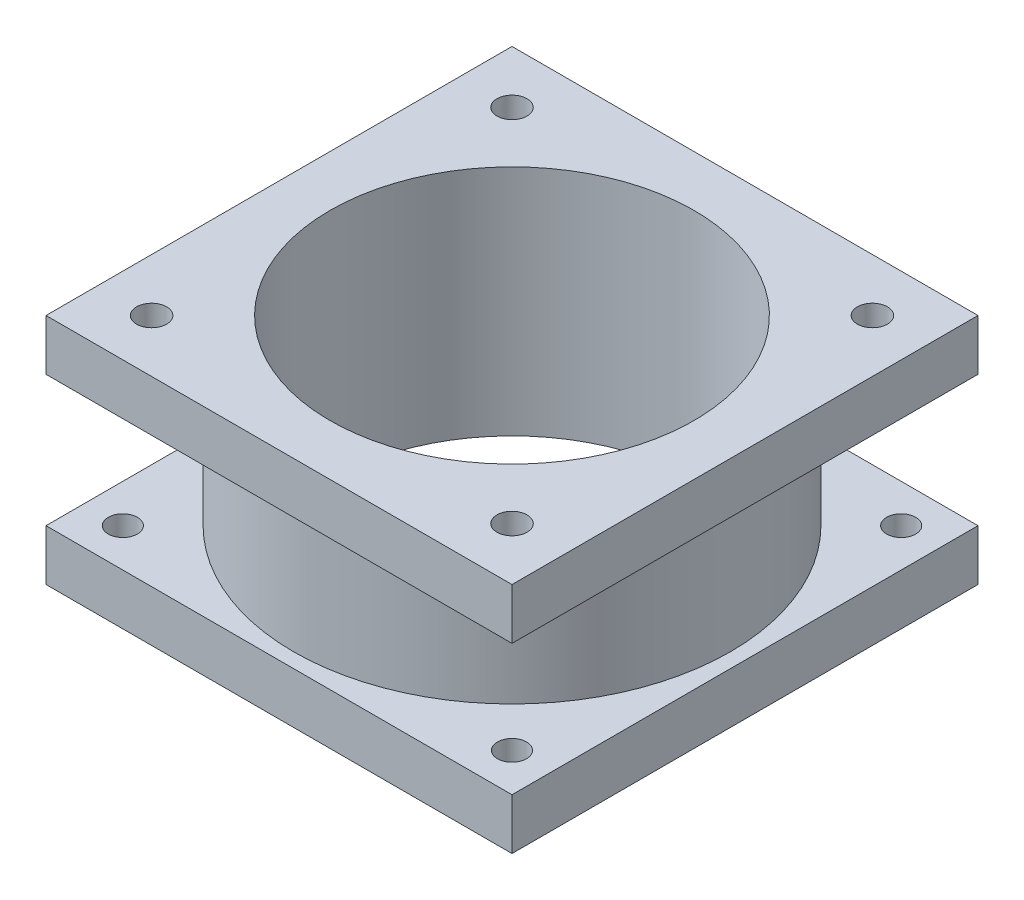
ISO-10303-21;
HEADER;
FILE_DESCRIPTION(('STEP AP214'),'2;1');
FILE_NAME('part.step','',(''),(''),'','','');
FILE_SCHEMA(('AUTOMOTIVE_DESIGN { 1 0 10303 214 1 1 1 1 }'));
ENDSEC;
DATA;
#1=APPLICATION_CONTEXT('core data for automotive mechanical design processes');
#2=APPLICATION_PROTOCOL_DEFINITION('international standard','automotive_design',2000,#1);
#3=PRODUCT_CONTEXT('',#1,'mechanical');
#4=PRODUCT('Part','Part','',(#3));
#5=PRODUCT_RELATED_PRODUCT_CATEGORY('part','',(#4));
#6=PRODUCT_DEFINITION_FORMATION('','',#4);
#7=PRODUCT_DEFINITION_CONTEXT('part definition',#1,'design');
#8=PRODUCT_DEFINITION('design','',#6,#7);
#9=PRODUCT_DEFINITION_SHAPE('','',#8);
#10=(LENGTH_UNIT() NAMED_UNIT(*) SI_UNIT(.MILLI.,.METRE.));
#11=(NAMED_UNIT(*) PLANE_ANGLE_UNIT() SI_UNIT($,.RADIAN.));
#12=(NAMED_UNIT(*) SI_UNIT($,.STERADIAN.) SOLID_ANGLE_UNIT());
#13=UNCERTAINTY_MEASURE_WITH_UNIT(LENGTH_MEASURE(1.E-05),#10,'distance_accuracy_value','');
#14=(GEOMETRIC_REPRESENTATION_CONTEXT(3) GLOBAL_UNCERTAINTY_ASSIGNED_CONTEXT((#13)) GLOBAL_UNIT_ASSIGNED_CONTEXT((#10,
#11,#12)) REPRESENTATION_CONTEXT('',''));
#15=CARTESIAN_POINT('',(0.,0.,0.));
#16=DIRECTION('',(0.,0.,1.));
#17=DIRECTION('',(1.,0.,0.));
#18=AXIS2_PLACEMENT_3D('',#15,#16,#17);
#19=CARTESIAN_POINT('',(0.,0.,0.));
#20=DIRECTION('',(0.,1.,0.));
#21=DIRECTION('',(1.,0.,0.));
#22=AXIS2_PLACEMENT_3D('',#19,#20,#21);
#23=PLANE('',#22);
#24=CARTESIAN_POINT('',(0.,0.,0.));
#25=DIRECTION('',(0.,1.,0.));
#26=DIRECTION('',(1.,0.,0.));
#27=AXIS2_PLACEMENT_3D('',#24,#25,#26);
#28=CIRCLE('',#27,25.);
#29=CARTESIAN_POINT('',(-25.,0.,0.));
#30=VERTEX_POINT('',#29);
#31=EDGE_CURVE('E205',#30,#30,#28,.T.);
#32=ORIENTED_EDGE('',*,*,#31,.T.);
#33=EDGE_LOOP('',(#32));
#34=FACE_BOUND('',#33,.T.);
#35=CARTESIAN_POINT('',(-26.7235211579369,0.,-26.7235211579369));
#36=DIRECTION('',(0.,1.,0.));
#37=DIRECTION('',(1.,0.,0.));
#38=AXIS2_PLACEMENT_3D('',#35,#36,#37);
#39=CIRCLE('',#38,2.);
#40=CARTESIAN_POINT('',(-28.7235211579369,0.,-26.7235211579369));
#41=VERTEX_POINT('',#40);
#42=EDGE_CURVE('E216',#41,#41,#39,.T.);
#43=ORIENTED_EDGE('',*,*,#42,.T.);
#44=EDGE_LOOP('',(#43));
#45=FACE_BOUND('',#44,.T.);
#46=CARTESIAN_POINT('',(26.7235211579369,0.,26.7235211579369));
#47=DIRECTION('',(0.,1.,0.));
#48=DIRECTION('',(1.,0.,0.));
#49=AXIS2_PLACEMENT_3D('',#46,#47,#48);
#50=CIRCLE('',#49,2.);
#51=CARTESIAN_POINT('',(24.7235211579369,0.,26.7235211579369));
#52=VERTEX_POINT('',#51);
#53=EDGE_CURVE('E277',#52,#52,#50,.T.);
#54=ORIENTED_EDGE('',*,*,#53,.T.);
#55=EDGE_LOOP('',(#54));
#56=FACE_BOUND('',#55,.T.);
#57=CARTESIAN_POINT('',(-26.7235211579369,0.,26.7235211579369));
#58=DIRECTION('',(0.,1.,0.));
#59=DIRECTION('',(1.,0.,0.));
#60=AXIS2_PLACEMENT_3D('',#57,#58,#59);
#61=CIRCLE('',#60,2.);
#62=CARTESIAN_POINT('',(-28.7235211579369,0.,26.7235211579369));
#63=VERTEX_POINT('',#62);
#64=EDGE_CURVE('E346',#63,#63,#61,.T.);
#65=ORIENTED_EDGE('',*,*,#64,.T.);
#66=EDGE_LOOP('',(#65));
#67=FACE_BOUND('',#66,.T.);
#68=CARTESIAN_POINT('',(26.7235211579369,0.,-26.7235211579369));
#69=DIRECTION('',(0.,1.,0.));
#70=DIRECTION('',(1.,0.,0.));
#71=AXIS2_PLACEMENT_3D('',#68,#69,#70);
#72=CIRCLE('',#71,2.);
#73=CARTESIAN_POINT('',(24.7235211579369,0.,-26.7235211579369));
#74=VERTEX_POINT('',#73);
#75=EDGE_CURVE('E297',#74,#74,#72,.T.);
#76=ORIENTED_EDGE('',*,*,#75,.T.);
#77=EDGE_LOOP('',(#76));
#78=FACE_BOUND('',#77,.T.);
#79=DIRECTION('',(0.,0.,1.));
#80=VECTOR('',#79,1.);
#81=CARTESIAN_POINT('',(-32.,0.,-32.));
#82=LINE('',#81,#80);
#83=CARTESIAN_POINT('',(-32.,0.,-32.));
#84=VERTEX_POINT('',#83);
#85=CARTESIAN_POINT('',(-32.,0.,32.));
#86=VERTEX_POINT('',#85);
#87=EDGE_CURVE('E28',#84,#86,#82,.T.);
#88=ORIENTED_EDGE('',*,*,#87,.F.);
#89=DIRECTION('',(-1.,0.,0.));
#90=VECTOR('',#89,1.);
#91=CARTESIAN_POINT('',(32.,0.,-32.));
#92=LINE('',#91,#90);
#93=CARTESIAN_POINT('',(32.,0.,-32.));
#94=VERTEX_POINT('',#93);
#95=EDGE_CURVE('E256',#94,#84,#92,.T.);
#96=ORIENTED_EDGE('',*,*,#95,.F.);
#97=DIRECTION('',(0.,0.,-1.));
#98=VECTOR('',#97,1.);
#99=CARTESIAN_POINT('',(32.,0.,32.));
#100=LINE('',#99,#98);
#101=CARTESIAN_POINT('',(32.,0.,32.));
#102=VERTEX_POINT('',#101);
#103=EDGE_CURVE('E234',#102,#94,#100,.T.);
#104=ORIENTED_EDGE('',*,*,#103,.F.);
#105=DIRECTION('',(1.,0.,0.));
#106=VECTOR('',#105,1.);
#107=CARTESIAN_POINT('',(-32.,0.,32.));
#108=LINE('',#107,#106);
#109=EDGE_CURVE('E223',#86,#102,#108,.T.);
#110=ORIENTED_EDGE('',*,*,#109,.F.);
#111=EDGE_LOOP('',(#88,#96,#104,#110));
#112=FACE_BOUND('',#111,.T.);
#113=ADVANCED_FACE('F17',(#34,#45,#56,#67,#78,#112),#23,.F.);
#114=CARTESIAN_POINT('',(0.,7.,0.));
#115=DIRECTION('',(0.,1.,0.));
#116=DIRECTION('',(1.,0.,0.));
#117=AXIS2_PLACEMENT_3D('',#114,#115,#116);
#118=PLANE('',#117);
#119=CARTESIAN_POINT('',(0.,7.,0.));
#120=DIRECTION('',(0.,-1.,0.));
#121=DIRECTION('',(1.,0.,0.));
#122=AXIS2_PLACEMENT_3D('',#119,#120,#121);
#123=CIRCLE('',#122,30.);
#124=CARTESIAN_POINT('',(-30.,7.,0.));
#125=VERTEX_POINT('',#124);
#126=EDGE_CURVE('E253',#125,#125,#123,.T.);
#127=ORIENTED_EDGE('',*,*,#126,.T.);
#128=EDGE_LOOP('',(#127));
#129=FACE_BOUND('',#128,.T.);
#130=CARTESIAN_POINT('',(-26.7235211579369,7.,-26.7235211579369));
#131=DIRECTION('',(0.,-1.,0.));
#132=DIRECTION('',(1.,0.,0.));
#133=AXIS2_PLACEMENT_3D('',#130,#131,#132);
#134=CIRCLE('',#133,2.);
#135=CARTESIAN_POINT('',(-28.7235211579369,7.,-26.7235211579369));
#136=VERTEX_POINT('',#135);
#137=EDGE_CURVE('E273',#136,#136,#134,.T.);
#138=ORIENTED_EDGE('',*,*,#137,.T.);
#139=EDGE_LOOP('',(#138));
#140=FACE_BOUND('',#139,.T.);
#141=CARTESIAN_POINT('',(26.7235211579369,7.,26.7235211579369));
#142=DIRECTION('',(0.,-1.,0.));
#143=DIRECTION('',(1.,0.,0.));
#144=AXIS2_PLACEMENT_3D('',#141,#142,#143);
#145=CIRCLE('',#144,2.);
#146=CARTESIAN_POINT('',(24.7235211579369,7.,26.7235211579369));
#147=VERTEX_POINT('',#146);
#148=EDGE_CURVE('E357',#147,#147,#145,.T.);
#149=ORIENTED_EDGE('',*,*,#148,.T.);
#150=EDGE_LOOP('',(#149));
#151=FACE_BOUND('',#150,.T.);
#152=CARTESIAN_POINT('',(-26.7235211579369,7.,26.7235211579369));
#153=DIRECTION('',(0.,-1.,0.));
#154=DIRECTION('',(1.,0.,0.));
#155=AXIS2_PLACEMENT_3D('',#152,#153,#154);
#156=CIRCLE('',#155,2.);
#157=CARTESIAN_POINT('',(-28.7235211579369,7.,26.7235211579369));
#158=VERTEX_POINT('',#157);
#159=EDGE_CURVE('E292',#158,#158,#156,.T.);
#160=ORIENTED_EDGE('',*,*,#159,.T.);
#161=EDGE_LOOP('',(#160));
#162=FACE_BOUND('',#161,.T.);
#163=CARTESIAN_POINT('',(26.7235211579369,7.,-26.7235211579369));
#164=DIRECTION('',(0.,-1.,0.));
#165=DIRECTION('',(1.,0.,0.));
#166=AXIS2_PLACEMENT_3D('',#163,#164,#165);
#167=CIRCLE('',#166,2.);
#168=CARTESIAN_POINT('',(24.7235211579369,7.,-26.7235211579369));
#169=VERTEX_POINT('',#168);
#170=EDGE_CURVE('E265',#169,#169,#167,.T.);
#171=ORIENTED_EDGE('',*,*,#170,.T.);
#172=EDGE_LOOP('',(#171));
#173=FACE_BOUND('',#172,.T.);
#174=DIRECTION('',(0.,0.,1.));
#175=VECTOR('',#174,1.);
#176=CARTESIAN_POINT('',(-32.,7.,-32.));
#177=LINE('',#176,#175);
#178=CARTESIAN_POINT('',(-32.,7.,-32.));
#179=VERTEX_POINT('',#178);
#180=CARTESIAN_POINT('',(-32.,7.,32.));
#181=VERTEX_POINT('',#180);
#182=EDGE_CURVE('E11',#179,#181,#177,.T.);
#183=ORIENTED_EDGE('',*,*,#182,.T.);
#184=DIRECTION('',(1.,0.,0.));
#185=VECTOR('',#184,1.);
#186=CARTESIAN_POINT('',(-32.,7.,32.));
#187=LINE('',#186,#185);
#188=CARTESIAN_POINT('',(32.,7.,32.));
#189=VERTEX_POINT('',#188);
#190=EDGE_CURVE('E231',#181,#189,#187,.T.);
#191=ORIENTED_EDGE('',*,*,#190,.T.);
#192=DIRECTION('',(0.,0.,-1.));
#193=VECTOR('',#192,1.);
#194=CARTESIAN_POINT('',(32.,7.,32.));
#195=LINE('',#194,#193);
#196=CARTESIAN_POINT('',(32.,7.,-32.));
#197=VERTEX_POINT('',#196);
#198=EDGE_CURVE('E224',#189,#197,#195,.T.);
#199=ORIENTED_EDGE('',*,*,#198,.T.);
#200=DIRECTION('',(-1.,0.,0.));
#201=VECTOR('',#200,1.);
#202=CARTESIAN_POINT('',(32.,7.,-32.));
#203=LINE('',#202,#201);
#204=EDGE_CURVE('E245',#197,#179,#203,.T.);
#205=ORIENTED_EDGE('',*,*,#204,.T.);
#206=EDGE_LOOP('',(#183,#191,#199,#205));
#207=FACE_BOUND('',#206,.T.);
#208=ADVANCED_FACE('F421',(#129,#140,#151,#162,#173,#207),#118,.T.);
#209=CARTESIAN_POINT('',(-32.,0.,-32.));
#210=DIRECTION('',(-1.,0.,0.));
#211=DIRECTION('',(0.,0.,1.));
#212=AXIS2_PLACEMENT_3D('',#209,#210,#211);
#213=PLANE('',#212);
#214=ORIENTED_EDGE('',*,*,#87,.T.);
#215=DIRECTION('',(0.,1.,0.));
#216=VECTOR('',#215,1.);
#217=CARTESIAN_POINT('',(-32.,0.,32.));
#218=LINE('',#217,#216);
#219=EDGE_CURVE('E248',#86,#181,#218,.T.);
#220=ORIENTED_EDGE('',*,*,#219,.T.);
#221=ORIENTED_EDGE('',*,*,#182,.F.);
#222=DIRECTION('',(0.,1.,0.));
#223=VECTOR('',#222,1.);
#224=CARTESIAN_POINT('',(-32.,0.,-32.));
#225=LINE('',#224,#223);
#226=EDGE_CURVE('E261',#84,#179,#225,.T.);
#227=ORIENTED_EDGE('',*,*,#226,.F.);
#228=EDGE_LOOP('',(#214,#220,#221,#227));
#229=FACE_BOUND('',#228,.T.);
#230=ADVANCED_FACE('F427',(#229),#213,.T.);
#231=CARTESIAN_POINT('',(-32.,0.,32.));
#232=DIRECTION('',(0.,0.,1.));
#233=DIRECTION('',(1.,0.,0.));
#234=AXIS2_PLACEMENT_3D('',#231,#232,#233);
#235=PLANE('',#234);
#236=ORIENTED_EDGE('',*,*,#109,.T.);
#237=DIRECTION('',(0.,1.,0.));
#238=VECTOR('',#237,1.);
#239=CARTESIAN_POINT('',(32.,0.,32.));
#240=LINE('',#239,#238);
#241=EDGE_CURVE('E220',#102,#189,#240,.T.);
#242=ORIENTED_EDGE('',*,*,#241,.T.);
#243=ORIENTED_EDGE('',*,*,#190,.F.);
#244=ORIENTED_EDGE('',*,*,#219,.F.);
#245=EDGE_LOOP('',(#236,#242,#243,#244));
#246=FACE_BOUND('',#245,.T.);
#247=ADVANCED_FACE('F441',(#246),#235,.T.);
#248=CARTESIAN_POINT('',(32.,0.,32.));
#249=DIRECTION('',(1.,0.,0.));
#250=DIRECTION('',(0.,1.,0.));
#251=AXIS2_PLACEMENT_3D('',#248,#249,#250);
#252=PLANE('',#251);
#253=ORIENTED_EDGE('',*,*,#103,.T.);
#254=DIRECTION('',(0.,1.,0.));
#255=VECTOR('',#254,1.);
#256=CARTESIAN_POINT('',(32.,0.,-32.));
#257=LINE('',#256,#255);
#258=EDGE_CURVE('E241',#94,#197,#257,.T.);
#259=ORIENTED_EDGE('',*,*,#258,.T.);
#260=ORIENTED_EDGE('',*,*,#198,.F.);
#261=ORIENTED_EDGE('',*,*,#241,.F.);
#262=EDGE_LOOP('',(#253,#259,#260,#261));
#263=FACE_BOUND('',#262,.T.);
#264=ADVANCED_FACE('F439',(#263),#252,.T.);
#265=CARTESIAN_POINT('',(32.,0.,-32.));
#266=DIRECTION('',(0.,0.,-1.));
#267=DIRECTION('',(0.,-1.,0.));
#268=AXIS2_PLACEMENT_3D('',#265,#266,#267);
#269=PLANE('',#268);
#270=ORIENTED_EDGE('',*,*,#95,.T.);
#271=ORIENTED_EDGE('',*,*,#226,.T.);
#272=ORIENTED_EDGE('',*,*,#204,.F.);
#273=ORIENTED_EDGE('',*,*,#258,.F.);
#274=EDGE_LOOP('',(#270,#271,#272,#273));
#275=FACE_BOUND('',#274,.T.);
#276=ADVANCED_FACE('F19',(#275),#269,.T.);
#277=CARTESIAN_POINT('',(0.,7.,0.));
#278=DIRECTION('',(0.,1.,0.));
#279=DIRECTION('',(1.,0.,0.));
#280=AXIS2_PLACEMENT_3D('',#277,#278,#279);
#281=CYLINDRICAL_SURFACE('',#280,30.);
#282=CARTESIAN_POINT('',(0.,25.,0.));
#283=DIRECTION('',(0.,1.,0.));
#284=DIRECTION('',(1.,0.,0.));
#285=AXIS2_PLACEMENT_3D('',#282,#283,#284);
#286=CIRCLE('',#285,30.);
#287=CARTESIAN_POINT('',(-30.,25.,0.));
#288=VERTEX_POINT('',#287);
#289=EDGE_CURVE('E187',#288,#288,#286,.T.);
#290=ORIENTED_EDGE('',*,*,#289,.F.);
#291=DIRECTION('',(0.,-1.,0.));
#292=VECTOR('',#291,1.);
#293=CARTESIAN_POINT('',(-30.,7.,0.));
#294=LINE('',#293,#292);
#295=EDGE_CURVE('E257',#288,#125,#294,.T.);
#296=ORIENTED_EDGE('',*,*,#295,.T.);
#297=ORIENTED_EDGE('',*,*,#126,.F.);
#298=ORIENTED_EDGE('',*,*,#295,.F.);
#299=EDGE_LOOP('',(#290,#296,#297,#298));
#300=FACE_BOUND('',#299,.T.);
#301=ADVANCED_FACE('F396',(#300),#281,.T.);
#302=CARTESIAN_POINT('',(0.,32.,0.));
#303=DIRECTION('',(0.,1.,0.));
#304=DIRECTION('',(1.,0.,0.));
#305=AXIS2_PLACEMENT_3D('',#302,#303,#304);
#306=PLANE('',#305);
#307=CARTESIAN_POINT('',(0.,32.,0.));
#308=DIRECTION('',(0.,-1.,0.));
#309=DIRECTION('',(1.,0.,0.));
#310=AXIS2_PLACEMENT_3D('',#307,#308,#309);
#311=CIRCLE('',#310,25.);
#312=CARTESIAN_POINT('',(-25.,32.,0.));
#313=VERTEX_POINT('',#312);
#314=EDGE_CURVE('E218',#313,#313,#311,.T.);
#315=ORIENTED_EDGE('',*,*,#314,.T.);
#316=EDGE_LOOP('',(#315));
#317=FACE_BOUND('',#316,.T.);
#318=CARTESIAN_POINT('',(-24.7487373415292,32.,-24.7487373415292));
#319=DIRECTION('',(0.,-1.,0.));
#320=DIRECTION('',(1.,0.,0.));
#321=AXIS2_PLACEMENT_3D('',#318,#319,#320);
#322=CIRCLE('',#321,2.067);
#323=CARTESIAN_POINT('',(-26.8157373415292,32.,-24.7487373415292));
#324=VERTEX_POINT('',#323);
#325=EDGE_CURVE('E290',#324,#324,#322,.T.);
#326=ORIENTED_EDGE('',*,*,#325,.T.);
#327=EDGE_LOOP('',(#326));
#328=FACE_BOUND('',#327,.T.);
#329=CARTESIAN_POINT('',(24.7487373415292,32.,24.7487373415292));
#330=DIRECTION('',(0.,-1.,0.));
#331=DIRECTION('',(1.,0.,0.));
#332=AXIS2_PLACEMENT_3D('',#329,#330,#331);
#333=CIRCLE('',#332,2.067);
#334=CARTESIAN_POINT('',(22.6817373415292,32.,24.7487373415292));
#335=VERTEX_POINT('',#334);
#336=EDGE_CURVE('E361',#335,#335,#333,.T.);
#337=ORIENTED_EDGE('',*,*,#336,.T.);
#338=EDGE_LOOP('',(#337));
#339=FACE_BOUND('',#338,.T.);
#340=CARTESIAN_POINT('',(-24.7487373415292,32.,24.7487373415292));
#341=DIRECTION('',(0.,-1.,0.));
#342=DIRECTION('',(1.,0.,0.));
#343=AXIS2_PLACEMENT_3D('',#340,#341,#342);
#344=CIRCLE('',#343,2.067);
#345=CARTESIAN_POINT('',(-26.8157373415292,32.,24.7487373415292));
#346=VERTEX_POINT('',#345);
#347=EDGE_CURVE('E303',#346,#346,#344,.T.);
#348=ORIENTED_EDGE('',*,*,#347,.T.);
#349=EDGE_LOOP('',(#348));
#350=FACE_BOUND('',#349,.T.);
#351=CARTESIAN_POINT('',(24.7487373415292,32.,-24.7487373415292));
#352=DIRECTION('',(0.,-1.,0.));
#353=DIRECTION('',(1.,0.,0.));
#354=AXIS2_PLACEMENT_3D('',#351,#352,#353);
#355=CIRCLE('',#354,2.067);
#356=CARTESIAN_POINT('',(22.6817373415292,32.,-24.7487373415292));
#357=VERTEX_POINT('',#356);
#358=EDGE_CURVE('E317',#357,#357,#355,.T.);
#359=ORIENTED_EDGE('',*,*,#358,.T.);
#360=EDGE_LOOP('',(#359));
#361=FACE_BOUND('',#360,.T.);
#362=DIRECTION('',(0.,0.,1.));
#363=VECTOR('',#362,1.);
#364=CARTESIAN_POINT('',(-32.,32.,-32.));
#365=LINE('',#364,#363);
#366=CARTESIAN_POINT('',(-32.,32.,-32.));
#367=VERTEX_POINT('',#366);
#368=CARTESIAN_POINT('',(-32.,32.,32.));
#369=VERTEX_POINT('',#368);
#370=EDGE_CURVE('E181',#367,#369,#365,.T.);
#371=ORIENTED_EDGE('',*,*,#370,.T.);
#372=DIRECTION('',(1.,0.,0.));
#373=VECTOR('',#372,1.);
#374=CARTESIAN_POINT('',(-32.,32.,32.));
#375=LINE('',#374,#373);
#376=CARTESIAN_POINT('',(32.,32.,32.));
#377=VERTEX_POINT('',#376);
#378=EDGE_CURVE('E285',#369,#377,#375,.T.);
#379=ORIENTED_EDGE('',*,*,#378,.T.);
#380=DIRECTION('',(0.,0.,-1.));
#381=VECTOR('',#380,1.);
#382=CARTESIAN_POINT('',(32.,32.,32.));
#383=LINE('',#382,#381);
#384=CARTESIAN_POINT('',(32.,32.,-32.));
#385=VERTEX_POINT('',#384);
#386=EDGE_CURVE('E286',#377,#385,#383,.T.);
#387=ORIENTED_EDGE('',*,*,#386,.T.);
#388=DIRECTION('',(-1.,0.,0.));
#389=VECTOR('',#388,1.);
#390=CARTESIAN_POINT('',(32.,32.,-32.));
#391=LINE('',#390,#389);
#392=EDGE_CURVE('E186',#385,#367,#391,.T.);
#393=ORIENTED_EDGE('',*,*,#392,.T.);
#394=EDGE_LOOP('',(#371,#379,#387,#393));
#395=FACE_BOUND('',#394,.T.);
#396=ADVANCED_FACE('F393',(#317,#328,#339,#350,#361,#395),#306,.T.);
#397=CARTESIAN_POINT('',(-32.,25.,-32.));
#398=DIRECTION('',(-1.,0.,0.));
#399=DIRECTION('',(0.,0.,1.));
#400=AXIS2_PLACEMENT_3D('',#397,#398,#399);
#401=PLANE('',#400);
#402=DIRECTION('',(0.,0.,1.));
#403=VECTOR('',#402,1.);
#404=CARTESIAN_POINT('',(-32.,25.,-32.));
#405=LINE('',#404,#403);
#406=CARTESIAN_POINT('',(-32.,25.,-32.));
#407=VERTEX_POINT('',#406);
#408=CARTESIAN_POINT('',(-32.,25.,32.));
#409=VERTEX_POINT('',#408);
#410=EDGE_CURVE('E180',#407,#409,#405,.T.);
#411=ORIENTED_EDGE('',*,*,#410,.T.);
#412=DIRECTION('',(0.,1.,0.));
#413=VECTOR('',#412,1.);
#414=CARTESIAN_POINT('',(-32.,25.,32.));
#415=LINE('',#414,#413);
#416=EDGE_CURVE('E272',#409,#369,#415,.T.);
#417=ORIENTED_EDGE('',*,*,#416,.T.);
#418=ORIENTED_EDGE('',*,*,#370,.F.);
#419=DIRECTION('',(0.,1.,0.));
#420=VECTOR('',#419,1.);
#421=CARTESIAN_POINT('',(-32.,25.,-32.));
#422=LINE('',#421,#420);
#423=EDGE_CURVE('E175',#407,#367,#422,.T.);
#424=ORIENTED_EDGE('',*,*,#423,.F.);
#425=EDGE_LOOP('',(#411,#417,#418,#424));
#426=FACE_BOUND('',#425,.T.);
#427=ADVANCED_FACE('F177',(#426),#401,.T.);
#428=CARTESIAN_POINT('',(-32.,25.,32.));
#429=DIRECTION('',(0.,0.,1.));
#430=DIRECTION('',(1.,0.,0.));
#431=AXIS2_PLACEMENT_3D('',#428,#429,#430);
#432=PLANE('',#431);
#433=DIRECTION('',(1.,0.,0.));
#434=VECTOR('',#433,1.);
#435=CARTESIAN_POINT('',(-32.,25.,32.));
#436=LINE('',#435,#434);
#437=CARTESIAN_POINT('',(32.,25.,32.));
#438=VERTEX_POINT('',#437);
#439=EDGE_CURVE('E203',#409,#438,#436,.T.);
#440=ORIENTED_EDGE('',*,*,#439,.T.);
#441=DIRECTION('',(0.,1.,0.));
#442=VECTOR('',#441,1.);
#443=CARTESIAN_POINT('',(32.,25.,32.));
#444=LINE('',#443,#442);
#445=EDGE_CURVE('E281',#438,#377,#444,.T.);
#446=ORIENTED_EDGE('',*,*,#445,.T.);
#447=ORIENTED_EDGE('',*,*,#378,.F.);
#448=ORIENTED_EDGE('',*,*,#416,.F.);
#449=EDGE_LOOP('',(#440,#446,#447,#448));
#450=FACE_BOUND('',#449,.T.);
#451=ADVANCED_FACE('F402',(#450),#432,.T.);
#452=CARTESIAN_POINT('',(32.,25.,32.));
#453=DIRECTION('',(1.,0.,0.));
#454=DIRECTION('',(0.,1.,0.));
#455=AXIS2_PLACEMENT_3D('',#452,#453,#454);
#456=PLANE('',#455);
#457=DIRECTION('',(0.,0.,-1.));
#458=VECTOR('',#457,1.);
#459=CARTESIAN_POINT('',(32.,25.,32.));
#460=LINE('',#459,#458);
#461=CARTESIAN_POINT('',(32.,25.,-32.));
#462=VERTEX_POINT('',#461);
#463=EDGE_CURVE('E198',#438,#462,#460,.T.);
#464=ORIENTED_EDGE('',*,*,#463,.T.);
#465=DIRECTION('',(0.,1.,0.));
#466=VECTOR('',#465,1.);
#467=CARTESIAN_POINT('',(32.,25.,-32.));
#468=LINE('',#467,#466);
#469=EDGE_CURVE('E193',#462,#385,#468,.T.);
#470=ORIENTED_EDGE('',*,*,#469,.T.);
#471=ORIENTED_EDGE('',*,*,#386,.F.);
#472=ORIENTED_EDGE('',*,*,#445,.F.);
#473=EDGE_LOOP('',(#464,#470,#471,#472));
#474=FACE_BOUND('',#473,.T.);
#475=ADVANCED_FACE('F405',(#474),#456,.T.);
#476=CARTESIAN_POINT('',(32.,25.,-32.));
#477=DIRECTION('',(0.,0.,-1.));
#478=DIRECTION('',(0.,-1.,0.));
#479=AXIS2_PLACEMENT_3D('',#476,#477,#478);
#480=PLANE('',#479);
#481=DIRECTION('',(-1.,0.,0.));
#482=VECTOR('',#481,1.);
#483=CARTESIAN_POINT('',(32.,25.,-32.));
#484=LINE('',#483,#482);
#485=EDGE_CURVE('E190',#462,#407,#484,.T.);
#486=ORIENTED_EDGE('',*,*,#485,.T.);
#487=ORIENTED_EDGE('',*,*,#423,.T.);
#488=ORIENTED_EDGE('',*,*,#392,.F.);
#489=ORIENTED_EDGE('',*,*,#469,.F.);
#490=EDGE_LOOP('',(#486,#487,#488,#489));
#491=FACE_BOUND('',#490,.T.);
#492=ADVANCED_FACE('F191',(#491),#480,.T.);
#493=CARTESIAN_POINT('',(0.,25.,0.));
#494=DIRECTION('',(0.,1.,0.));
#495=DIRECTION('',(1.,0.,0.));
#496=AXIS2_PLACEMENT_3D('',#493,#494,#495);
#497=PLANE('',#496);
#498=ORIENTED_EDGE('',*,*,#289,.T.);
#499=EDGE_LOOP('',(#498));
#500=FACE_BOUND('',#499,.T.);
#501=CARTESIAN_POINT('',(-24.7487373415292,25.,-24.7487373415292));
#502=DIRECTION('',(0.,1.,0.));
#503=DIRECTION('',(1.,0.,0.));
#504=AXIS2_PLACEMENT_3D('',#501,#502,#503);
#505=CIRCLE('',#504,2.067);
#506=CARTESIAN_POINT('',(-26.8157373415292,25.,-24.7487373415292));
#507=VERTEX_POINT('',#506);
#508=EDGE_CURVE('E21',#507,#507,#505,.T.);
#509=ORIENTED_EDGE('',*,*,#508,.T.);
#510=EDGE_LOOP('',(#509));
#511=FACE_BOUND('',#510,.T.);
#512=CARTESIAN_POINT('',(24.7487373415292,25.,24.7487373415292));
#513=DIRECTION('',(0.,1.,0.));
#514=DIRECTION('',(1.,0.,0.));
#515=AXIS2_PLACEMENT_3D('',#512,#513,#514);
#516=CIRCLE('',#515,2.067);
#517=CARTESIAN_POINT('',(22.6817373415292,25.,24.7487373415292));
#518=VERTEX_POINT('',#517);
#519=EDGE_CURVE('E287',#518,#518,#516,.T.);
#520=ORIENTED_EDGE('',*,*,#519,.T.);
#521=EDGE_LOOP('',(#520));
#522=FACE_BOUND('',#521,.T.);
#523=CARTESIAN_POINT('',(-24.7487373415292,25.,24.7487373415292));
#524=DIRECTION('',(0.,1.,0.));
#525=DIRECTION('',(1.,0.,0.));
#526=AXIS2_PLACEMENT_3D('',#523,#524,#525);
#527=CIRCLE('',#526,2.067);
#528=CARTESIAN_POINT('',(-26.8157373415292,25.,24.7487373415292));
#529=VERTEX_POINT('',#528);
#530=EDGE_CURVE('E302',#529,#529,#527,.T.);
#531=ORIENTED_EDGE('',*,*,#530,.T.);
#532=EDGE_LOOP('',(#531));
#533=FACE_BOUND('',#532,.T.);
#534=CARTESIAN_POINT('',(24.7487373415292,25.,-24.7487373415292));
#535=DIRECTION('',(0.,1.,0.));
#536=DIRECTION('',(1.,0.,0.));
#537=AXIS2_PLACEMENT_3D('',#534,#535,#536);
#538=CIRCLE('',#537,2.067);
#539=CARTESIAN_POINT('',(22.6817373415292,25.,-24.7487373415292));
#540=VERTEX_POINT('',#539);
#541=EDGE_CURVE('E337',#540,#540,#538,.T.);
#542=ORIENTED_EDGE('',*,*,#541,.T.);
#543=EDGE_LOOP('',(#542));
#544=FACE_BOUND('',#543,.T.);
#545=ORIENTED_EDGE('',*,*,#410,.F.);
#546=ORIENTED_EDGE('',*,*,#485,.F.);
#547=ORIENTED_EDGE('',*,*,#463,.F.);
#548=ORIENTED_EDGE('',*,*,#439,.F.);
#549=EDGE_LOOP('',(#545,#546,#547,#548));
#550=FACE_BOUND('',#549,.T.);
#551=ADVANCED_FACE('F201',(#500,#511,#522,#533,#544,#550),#497,.F.);
#552=CARTESIAN_POINT('',(0.,32.,0.));
#553=DIRECTION('',(0.,-1.,0.));
#554=DIRECTION('',(1.,0.,0.));
#555=AXIS2_PLACEMENT_3D('',#552,#553,#554);
#556=CYLINDRICAL_SURFACE('',#555,25.);
#557=ORIENTED_EDGE('',*,*,#314,.F.);
#558=DIRECTION('',(0.,-1.,0.));
#559=VECTOR('',#558,1.);
#560=CARTESIAN_POINT('',(-25.,32.,0.));
#561=LINE('',#560,#559);
#562=EDGE_CURVE('E211',#313,#30,#561,.T.);
#563=ORIENTED_EDGE('',*,*,#562,.T.);
#564=ORIENTED_EDGE('',*,*,#31,.F.);
#565=ORIENTED_EDGE('',*,*,#562,.F.);
#566=EDGE_LOOP('',(#557,#563,#564,#565));
#567=FACE_BOUND('',#566,.T.);
#568=ADVANCED_FACE('F467',(#567),#556,.F.);
#569=CARTESIAN_POINT('',(-26.7235211579369,-89.,-26.7235211579369));
#570=DIRECTION('',(0.,1.,0.));
#571=DIRECTION('',(1.,0.,0.));
#572=AXIS2_PLACEMENT_3D('',#569,#570,#571);
#573=CYLINDRICAL_SURFACE('',#572,2.);
#574=ORIENTED_EDGE('',*,*,#137,.F.);
#575=DIRECTION('',(0.,-1.,0.));
#576=VECTOR('',#575,1.);
#577=CARTESIAN_POINT('',(-28.7235211579369,-89.,-26.7235211579369));
#578=LINE('',#577,#576);
#579=EDGE_CURVE('E219',#136,#41,#578,.T.);
#580=ORIENTED_EDGE('',*,*,#579,.T.);
#581=ORIENTED_EDGE('',*,*,#42,.F.);
#582=ORIENTED_EDGE('',*,*,#579,.F.);
#583=EDGE_LOOP('',(#574,#580,#581,#582));
#584=FACE_BOUND('',#583,.T.);
#585=ADVANCED_FACE('F474',(#584),#573,.F.);
#586=CARTESIAN_POINT('',(26.7235211579369,-89.,26.7235211579369));
#587=DIRECTION('',(0.,1.,0.));
#588=DIRECTION('',(1.,0.,0.));
#589=AXIS2_PLACEMENT_3D('',#586,#587,#588);
#590=CYLINDRICAL_SURFACE('',#589,2.);
#591=ORIENTED_EDGE('',*,*,#148,.F.);
#592=DIRECTION('',(0.,-1.,0.));
#593=VECTOR('',#592,1.);
#594=CARTESIAN_POINT('',(24.7235211579369,-89.,26.7235211579369));
#595=LINE('',#594,#593);
#596=EDGE_CURVE('E316',#147,#52,#595,.T.);
#597=ORIENTED_EDGE('',*,*,#596,.T.);
#598=ORIENTED_EDGE('',*,*,#53,.F.);
#599=ORIENTED_EDGE('',*,*,#596,.F.);
#600=EDGE_LOOP('',(#591,#597,#598,#599));
#601=FACE_BOUND('',#600,.T.);
#602=ADVANCED_FACE('F433',(#601),#590,.F.);
#603=CARTESIAN_POINT('',(-26.7235211579369,-89.,26.7235211579369));
#604=DIRECTION('',(0.,1.,0.));
#605=DIRECTION('',(1.,0.,0.));
#606=AXIS2_PLACEMENT_3D('',#603,#604,#605);
#607=CYLINDRICAL_SURFACE('',#606,2.);
#608=ORIENTED_EDGE('',*,*,#159,.F.);
#609=DIRECTION('',(0.,-1.,0.));
#610=VECTOR('',#609,1.);
#611=CARTESIAN_POINT('',(-28.7235211579369,-89.,26.7235211579369));
#612=LINE('',#611,#610);
#613=EDGE_CURVE('E296',#158,#63,#612,.T.);
#614=ORIENTED_EDGE('',*,*,#613,.T.);
#615=ORIENTED_EDGE('',*,*,#64,.F.);
#616=ORIENTED_EDGE('',*,*,#613,.F.);
#617=EDGE_LOOP('',(#608,#614,#615,#616));
#618=FACE_BOUND('',#617,.T.);
#619=ADVANCED_FACE('F481',(#618),#607,.F.);
#620=CARTESIAN_POINT('',(26.7235211579369,-89.,-26.7235211579369));
#621=DIRECTION('',(0.,1.,0.));
#622=DIRECTION('',(1.,0.,0.));
#623=AXIS2_PLACEMENT_3D('',#620,#621,#622);
#624=CYLINDRICAL_SURFACE('',#623,2.);
#625=ORIENTED_EDGE('',*,*,#170,.F.);
#626=DIRECTION('',(0.,-1.,0.));
#627=VECTOR('',#626,1.);
#628=CARTESIAN_POINT('',(24.7235211579369,-89.,-26.7235211579369));
#629=LINE('',#628,#627);
#630=EDGE_CURVE('E269',#169,#74,#629,.T.);
#631=ORIENTED_EDGE('',*,*,#630,.T.);
#632=ORIENTED_EDGE('',*,*,#75,.F.);
#633=ORIENTED_EDGE('',*,*,#630,.F.);
#634=EDGE_LOOP('',(#625,#631,#632,#633));
#635=FACE_BOUND('',#634,.T.);
#636=ADVANCED_FACE('F472',(#635),#624,.F.);
#637=CARTESIAN_POINT('',(-24.7487373415292,-64.,-24.7487373415292));
#638=DIRECTION('',(0.,1.,0.));
#639=DIRECTION('',(1.,0.,0.));
#640=AXIS2_PLACEMENT_3D('',#637,#638,#639);
#641=CYLINDRICAL_SURFACE('',#640,2.067);
#642=ORIENTED_EDGE('',*,*,#325,.F.);
#643=DIRECTION('',(0.,-1.,0.));
#644=VECTOR('',#643,1.);
#645=CARTESIAN_POINT('',(-26.8157373415292,-64.,-24.7487373415292));
#646=LINE('',#645,#644);
#647=EDGE_CURVE('E310',#324,#507,#646,.T.);
#648=ORIENTED_EDGE('',*,*,#647,.T.);
#649=ORIENTED_EDGE('',*,*,#508,.F.);
#650=ORIENTED_EDGE('',*,*,#647,.F.);
#651=EDGE_LOOP('',(#642,#648,#649,#650));
#652=FACE_BOUND('',#651,.T.);
#653=ADVANCED_FACE('F436',(#652),#641,.F.);
#654=CARTESIAN_POINT('',(24.7487373415292,-64.,24.7487373415292));
#655=DIRECTION('',(0.,1.,0.));
#656=DIRECTION('',(1.,0.,0.));
#657=AXIS2_PLACEMENT_3D('',#654,#655,#656);
#658=CYLINDRICAL_SURFACE('',#657,2.067);
#659=ORIENTED_EDGE('',*,*,#336,.F.);
#660=DIRECTION('',(0.,-1.,0.));
#661=VECTOR('',#660,1.);
#662=CARTESIAN_POINT('',(22.6817373415292,-64.,24.7487373415292));
#663=LINE('',#662,#661);
#664=EDGE_CURVE('E291',#335,#518,#663,.T.);
#665=ORIENTED_EDGE('',*,*,#664,.T.);
#666=ORIENTED_EDGE('',*,*,#519,.F.);
#667=ORIENTED_EDGE('',*,*,#664,.F.);
#668=EDGE_LOOP('',(#659,#665,#666,#667));
#669=FACE_BOUND('',#668,.T.);
#670=ADVANCED_FACE('F434',(#669),#658,.F.);
#671=CARTESIAN_POINT('',(-24.7487373415292,-64.,24.7487373415292));
#672=DIRECTION('',(0.,1.,0.));
#673=DIRECTION('',(1.,0.,0.));
#674=AXIS2_PLACEMENT_3D('',#671,#672,#673);
#675=CYLINDRICAL_SURFACE('',#674,2.067);
#676=ORIENTED_EDGE('',*,*,#347,.F.);
#677=DIRECTION('',(0.,-1.,0.));
#678=VECTOR('',#677,1.);
#679=CARTESIAN_POINT('',(-26.8157373415292,-64.,24.7487373415292));
#680=LINE('',#679,#678);
#681=EDGE_CURVE('E298',#346,#529,#680,.T.);
#682=ORIENTED_EDGE('',*,*,#681,.T.);
#683=ORIENTED_EDGE('',*,*,#530,.F.);
#684=ORIENTED_EDGE('',*,*,#681,.F.);
#685=EDGE_LOOP('',(#676,#682,#683,#684));
#686=FACE_BOUND('',#685,.T.);
#687=ADVANCED_FACE('F391',(#686),#675,.F.);
#688=CARTESIAN_POINT('',(24.7487373415292,-64.,-24.7487373415292));
#689=DIRECTION('',(0.,1.,0.));
#690=DIRECTION('',(1.,0.,0.));
#691=AXIS2_PLACEMENT_3D('',#688,#689,#690);
#692=CYLINDRICAL_SURFACE('',#691,2.067);
#693=ORIENTED_EDGE('',*,*,#358,.F.);
#694=DIRECTION('',(0.,-1.,0.));
#695=VECTOR('',#694,1.);
#696=CARTESIAN_POINT('',(22.6817373415292,-64.,-24.7487373415292));
#697=LINE('',#696,#695);
#698=EDGE_CURVE('E321',#357,#540,#697,.T.);
#699=ORIENTED_EDGE('',*,*,#698,.T.);
#700=ORIENTED_EDGE('',*,*,#541,.F.);
#701=ORIENTED_EDGE('',*,*,#698,.F.);
#702=EDGE_LOOP('',(#693,#699,#700,#701));
#703=FACE_BOUND('',#702,.T.);
#704=ADVANCED_FACE('F480',(#703),#692,.F.);
#705=CLOSED_SHELL('',(#113,#208,#230,#247,#264,#276,#301,#396,#427,#451,#475,#492,#551,#568,
#585,#602,#619,#636,#653,#670,#687,#704));
#706=MANIFOLD_SOLID_BREP('B1',#705);
#707=ADVANCED_BREP_SHAPE_REPRESENTATION('',(#18,#706),#14);
#708=SHAPE_DEFINITION_REPRESENTATION(#9,#707);
ENDSEC;
END-ISO-10303-21;
